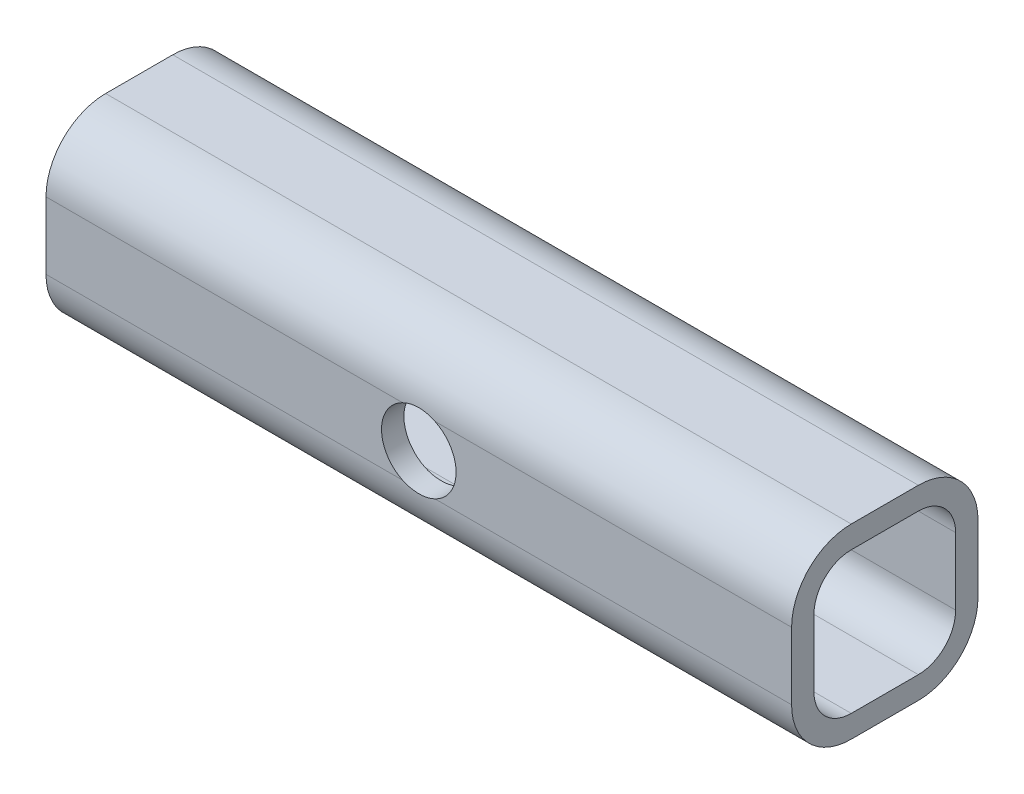
ISO-10303-21;
HEADER;
FILE_DESCRIPTION(('STEP AP214'),'2;1');
FILE_NAME('part.step','',(''),(''),'','','');
FILE_SCHEMA(('AUTOMOTIVE_DESIGN { 1 0 10303 214 1 1 1 1 }'));
ENDSEC;
DATA;
#1=APPLICATION_CONTEXT('core data for automotive mechanical design processes');
#2=APPLICATION_PROTOCOL_DEFINITION('international standard','automotive_design',2000,#1);
#3=PRODUCT_CONTEXT('',#1,'mechanical');
#4=PRODUCT('Part','Part','',(#3));
#5=PRODUCT_RELATED_PRODUCT_CATEGORY('part','',(#4));
#6=PRODUCT_DEFINITION_FORMATION('','',#4);
#7=PRODUCT_DEFINITION_CONTEXT('part definition',#1,'design');
#8=PRODUCT_DEFINITION('design','',#6,#7);
#9=PRODUCT_DEFINITION_SHAPE('','',#8);
#10=(LENGTH_UNIT() NAMED_UNIT(*) SI_UNIT(.MILLI.,.METRE.));
#11=(NAMED_UNIT(*) PLANE_ANGLE_UNIT() SI_UNIT($,.RADIAN.));
#12=(NAMED_UNIT(*) SI_UNIT($,.STERADIAN.) SOLID_ANGLE_UNIT());
#13=UNCERTAINTY_MEASURE_WITH_UNIT(LENGTH_MEASURE(1.E-05),#10,'distance_accuracy_value','');
#14=(GEOMETRIC_REPRESENTATION_CONTEXT(3) GLOBAL_UNCERTAINTY_ASSIGNED_CONTEXT((#13)) GLOBAL_UNIT_ASSIGNED_CONTEXT((#10,
#11,#12)) REPRESENTATION_CONTEXT('',''));
#15=CARTESIAN_POINT('',(0.,0.,0.));
#16=DIRECTION('',(0.,0.,1.));
#17=DIRECTION('',(1.,0.,0.));
#18=AXIS2_PLACEMENT_3D('',#15,#16,#17);
#19=CARTESIAN_POINT('',(0.,-4.5,12.5));
#20=DIRECTION('',(0.,0.,-1.));
#21=DIRECTION('',(-1.,0.,0.));
#22=AXIS2_PLACEMENT_3D('',#19,#20,#21);
#23=PLANE('',#22);
#24=DIRECTION('',(-1.,0.,0.));
#25=VECTOR('',#24,1.);
#26=CARTESIAN_POINT('',(0.,4.5,12.5));
#27=LINE('',#26,#25);
#28=CARTESIAN_POINT('',(0.,4.5,12.5));
#29=VERTEX_POINT('',#28);
#30=CARTESIAN_POINT('',(-47.8205505282297,4.5,12.5));
#31=VERTEX_POINT('',#30);
#32=EDGE_CURVE('E271',#29,#31,#27,.T.);
#33=ORIENTED_EDGE('',*,*,#32,.T.);
#34=CARTESIAN_POINT('',(-50.,0.,12.5));
#35=DIRECTION('',(0.,0.,1.));
#36=DIRECTION('',(1.,0.,0.));
#37=AXIS2_PLACEMENT_3D('',#34,#35,#36);
#38=CIRCLE('',#37,5.);
#39=CARTESIAN_POINT('',(-47.8205505282297,-4.5,12.5));
#40=VERTEX_POINT('',#39);
#41=EDGE_CURVE('E511',#40,#31,#38,.T.);
#42=ORIENTED_EDGE('',*,*,#41,.F.);
#43=DIRECTION('',(-1.,0.,0.));
#44=VECTOR('',#43,1.);
#45=CARTESIAN_POINT('',(0.,-4.5,12.5));
#46=LINE('',#45,#44);
#47=CARTESIAN_POINT('',(0.,-4.5,12.5));
#48=VERTEX_POINT('',#47);
#49=EDGE_CURVE('E267',#48,#40,#46,.T.);
#50=ORIENTED_EDGE('',*,*,#49,.F.);
#51=DIRECTION('',(0.,-1.,0.));
#52=VECTOR('',#51,1.);
#53=CARTESIAN_POINT('',(0.,-4.5,12.5));
#54=LINE('',#53,#52);
#55=EDGE_CURVE('E236',#29,#48,#54,.T.);
#56=ORIENTED_EDGE('',*,*,#55,.F.);
#57=EDGE_LOOP('',(#33,#42,#50,#56));
#58=FACE_BOUND('',#57,.T.);
#59=ADVANCED_FACE('F35',(#58),#23,.F.);
#60=CARTESIAN_POINT('',(0.,-4.5,-12.5));
#61=DIRECTION('',(0.,0.,1.));
#62=DIRECTION('',(1.,0.,0.));
#63=AXIS2_PLACEMENT_3D('',#60,#61,#62);
#64=PLANE('',#63);
#65=DIRECTION('',(-1.,0.,0.));
#66=VECTOR('',#65,1.);
#67=CARTESIAN_POINT('',(0.,4.5,-12.5));
#68=LINE('',#67,#66);
#69=CARTESIAN_POINT('',(-52.1794494717703,4.5,-12.5));
#70=VERTEX_POINT('',#69);
#71=CARTESIAN_POINT('',(-100.,4.5,-12.5));
#72=VERTEX_POINT('',#71);
#73=EDGE_CURVE('E222',#70,#72,#68,.T.);
#74=ORIENTED_EDGE('',*,*,#73,.F.);
#75=CARTESIAN_POINT('',(-50.,0.,-12.5));
#76=DIRECTION('',(0.,0.,1.));
#77=DIRECTION('',(1.,0.,0.));
#78=AXIS2_PLACEMENT_3D('',#75,#76,#77);
#79=CIRCLE('',#78,5.);
#80=CARTESIAN_POINT('',(-52.1794494717703,-4.5,-12.5));
#81=VERTEX_POINT('',#80);
#82=EDGE_CURVE('E65',#70,#81,#79,.T.);
#83=ORIENTED_EDGE('',*,*,#82,.T.);
#84=DIRECTION('',(1.,0.,0.));
#85=VECTOR('',#84,1.);
#86=CARTESIAN_POINT('',(0.,-4.5,-12.5));
#87=LINE('',#86,#85);
#88=CARTESIAN_POINT('',(-100.,-4.5,-12.5));
#89=VERTEX_POINT('',#88);
#90=EDGE_CURVE('E260',#81,#89,#87,.F.);
#91=ORIENTED_EDGE('',*,*,#90,.T.);
#92=DIRECTION('',(0.,1.,0.));
#93=VECTOR('',#92,1.);
#94=CARTESIAN_POINT('',(-100.,-4.5,-12.5));
#95=LINE('',#94,#93);
#96=EDGE_CURVE('E225',#89,#72,#95,.T.);
#97=ORIENTED_EDGE('',*,*,#96,.T.);
#98=EDGE_LOOP('',(#74,#83,#91,#97));
#99=FACE_BOUND('',#98,.T.);
#100=ADVANCED_FACE('F309',(#99),#64,.F.);
#101=CARTESIAN_POINT('',(0.,-4.5,9.5));
#102=DIRECTION('',(0.,0.,-1.));
#103=DIRECTION('',(-1.,0.,0.));
#104=AXIS2_PLACEMENT_3D('',#101,#102,#103);
#105=PLANE('',#104);
#106=CARTESIAN_POINT('',(-50.,0.,9.50000000000001));
#107=DIRECTION('',(0.,0.,-1.));
#108=DIRECTION('',(-1.,0.,0.));
#109=AXIS2_PLACEMENT_3D('',#106,#107,#108);
#110=CIRCLE('',#109,5.);
#111=CARTESIAN_POINT('',(-47.8205505282297,4.5,9.50000000000001));
#112=VERTEX_POINT('',#111);
#113=CARTESIAN_POINT('',(-47.8205505282297,-4.5,9.50000000000001));
#114=VERTEX_POINT('',#113);
#115=EDGE_CURVE('E366',#112,#114,#110,.T.);
#116=ORIENTED_EDGE('',*,*,#115,.F.);
#117=DIRECTION('',(-1.,0.,0.));
#118=VECTOR('',#117,1.);
#119=CARTESIAN_POINT('',(0.,4.5,9.5));
#120=LINE('',#119,#118);
#121=CARTESIAN_POINT('',(0.,4.5,9.5));
#122=VERTEX_POINT('',#121);
#123=EDGE_CURVE('E440',#122,#112,#120,.T.);
#124=ORIENTED_EDGE('',*,*,#123,.F.);
#125=DIRECTION('',(0.,-1.,0.));
#126=VECTOR('',#125,1.);
#127=CARTESIAN_POINT('',(0.,-4.5,9.5));
#128=LINE('',#127,#126);
#129=CARTESIAN_POINT('',(0.,-4.5,9.5));
#130=VERTEX_POINT('',#129);
#131=EDGE_CURVE('E436',#122,#130,#128,.T.);
#132=ORIENTED_EDGE('',*,*,#131,.T.);
#133=DIRECTION('',(-1.,0.,0.));
#134=VECTOR('',#133,1.);
#135=CARTESIAN_POINT('',(0.,-4.5,9.5));
#136=LINE('',#135,#134);
#137=EDGE_CURVE('E449',#130,#114,#136,.T.);
#138=ORIENTED_EDGE('',*,*,#137,.T.);
#139=EDGE_LOOP('',(#116,#124,#132,#138));
#140=FACE_BOUND('',#139,.T.);
#141=ADVANCED_FACE('F377',(#140),#105,.T.);
#142=CARTESIAN_POINT('',(0.,-4.5,-9.5));
#143=DIRECTION('',(0.,0.,1.));
#144=DIRECTION('',(1.,0.,0.));
#145=AXIS2_PLACEMENT_3D('',#142,#143,#144);
#146=PLANE('',#145);
#147=CARTESIAN_POINT('',(-50.,0.,-9.49999999999999));
#148=DIRECTION('',(0.,0.,1.));
#149=DIRECTION('',(1.,0.,0.));
#150=AXIS2_PLACEMENT_3D('',#147,#148,#149);
#151=CIRCLE('',#150,5.);
#152=CARTESIAN_POINT('',(-52.1794494717703,4.5,-9.49999999999999));
#153=VERTEX_POINT('',#152);
#154=CARTESIAN_POINT('',(-52.1794494717703,-4.5,-9.49999999999999));
#155=VERTEX_POINT('',#154);
#156=EDGE_CURVE('E506',#153,#155,#151,.T.);
#157=ORIENTED_EDGE('',*,*,#156,.F.);
#158=DIRECTION('',(-1.,0.,0.));
#159=VECTOR('',#158,1.);
#160=CARTESIAN_POINT('',(0.,4.5,-9.5));
#161=LINE('',#160,#159);
#162=CARTESIAN_POINT('',(-100.,4.5,-9.49999999999999));
#163=VERTEX_POINT('',#162);
#164=EDGE_CURVE('E481',#153,#163,#161,.T.);
#165=ORIENTED_EDGE('',*,*,#164,.T.);
#166=DIRECTION('',(0.,1.,0.));
#167=VECTOR('',#166,1.);
#168=CARTESIAN_POINT('',(-100.,-4.5,-9.49999999999999));
#169=LINE('',#168,#167);
#170=CARTESIAN_POINT('',(-100.,-4.5,-9.49999999999999));
#171=VERTEX_POINT('',#170);
#172=EDGE_CURVE('E477',#171,#163,#169,.T.);
#173=ORIENTED_EDGE('',*,*,#172,.F.);
#174=DIRECTION('',(-1.,0.,0.));
#175=VECTOR('',#174,1.);
#176=CARTESIAN_POINT('',(0.,-4.5,-9.5));
#177=LINE('',#176,#175);
#178=EDGE_CURVE('E473',#155,#171,#177,.T.);
#179=ORIENTED_EDGE('',*,*,#178,.F.);
#180=EDGE_LOOP('',(#157,#165,#173,#179));
#181=FACE_BOUND('',#180,.T.);
#182=ADVANCED_FACE('F394',(#181),#146,.T.);
#183=CARTESIAN_POINT('',(0.,4.5,4.5));
#184=DIRECTION('',(1.,0.,0.));
#185=DIRECTION('',(0.,0.,-1.));
#186=AXIS2_PLACEMENT_3D('',#183,#184,#185);
#187=PLANE('',#186);
#188=CARTESIAN_POINT('',(0.,4.5,4.5));
#189=DIRECTION('',(1.,0.,0.));
#190=DIRECTION('',(0.,0.,-1.));
#191=AXIS2_PLACEMENT_3D('',#188,#189,#190);
#192=CIRCLE('',#191,5.);
#193=CARTESIAN_POINT('',(0.,9.5,4.5));
#194=VERTEX_POINT('',#193);
#195=EDGE_CURVE('E423',#194,#122,#192,.T.);
#196=ORIENTED_EDGE('',*,*,#195,.F.);
#197=DIRECTION('',(0.,0.,1.));
#198=VECTOR('',#197,1.);
#199=CARTESIAN_POINT('',(0.,9.5,4.5));
#200=LINE('',#199,#198);
#201=CARTESIAN_POINT('',(0.,9.5,-4.5));
#202=VERTEX_POINT('',#201);
#203=EDGE_CURVE('E421',#202,#194,#200,.T.);
#204=ORIENTED_EDGE('',*,*,#203,.F.);
#205=CARTESIAN_POINT('',(0.,4.5,-4.5));
#206=DIRECTION('',(1.,0.,0.));
#207=DIRECTION('',(0.,0.,-1.));
#208=AXIS2_PLACEMENT_3D('',#205,#206,#207);
#209=CIRCLE('',#208,5.);
#210=CARTESIAN_POINT('',(0.,4.5,-9.5));
#211=VERTEX_POINT('',#210);
#212=EDGE_CURVE('E434',#211,#202,#209,.T.);
#213=ORIENTED_EDGE('',*,*,#212,.F.);
#214=DIRECTION('',(0.,1.,0.));
#215=VECTOR('',#214,1.);
#216=CARTESIAN_POINT('',(0.,-4.5,-9.5));
#217=LINE('',#216,#215);
#218=CARTESIAN_POINT('',(0.,-4.5,-9.5));
#219=VERTEX_POINT('',#218);
#220=EDGE_CURVE('E470',#219,#211,#217,.T.);
#221=ORIENTED_EDGE('',*,*,#220,.F.);
#222=CARTESIAN_POINT('',(0.,-4.5,-4.5));
#223=DIRECTION('',(1.,0.,0.));
#224=DIRECTION('',(0.,0.,-1.));
#225=AXIS2_PLACEMENT_3D('',#222,#223,#224);
#226=CIRCLE('',#225,5.);
#227=CARTESIAN_POINT('',(0.,-9.5,-4.5));
#228=VERTEX_POINT('',#227);
#229=EDGE_CURVE('E462',#228,#219,#226,.T.);
#230=ORIENTED_EDGE('',*,*,#229,.F.);
#231=DIRECTION('',(0.,0.,-1.));
#232=VECTOR('',#231,1.);
#233=CARTESIAN_POINT('',(0.,-9.5,4.5));
#234=LINE('',#233,#232);
#235=CARTESIAN_POINT('',(0.,-9.5,4.5));
#236=VERTEX_POINT('',#235);
#237=EDGE_CURVE('E454',#236,#228,#234,.T.);
#238=ORIENTED_EDGE('',*,*,#237,.F.);
#239=CARTESIAN_POINT('',(0.,-4.5,4.5));
#240=DIRECTION('',(1.,0.,0.));
#241=DIRECTION('',(0.,0.,-1.));
#242=AXIS2_PLACEMENT_3D('',#239,#240,#241);
#243=CIRCLE('',#242,5.);
#244=EDGE_CURVE('E445',#130,#236,#243,.T.);
#245=ORIENTED_EDGE('',*,*,#244,.F.);
#246=ORIENTED_EDGE('',*,*,#131,.F.);
#247=EDGE_LOOP('',(#196,#204,#213,#221,#230,#238,#245,#246));
#248=FACE_BOUND('',#247,.T.);
#249=CARTESIAN_POINT('',(0.,4.5,4.5));
#250=DIRECTION('',(1.,0.,0.));
#251=DIRECTION('',(0.,0.,-1.));
#252=AXIS2_PLACEMENT_3D('',#249,#250,#251);
#253=CIRCLE('',#252,8.);
#254=CARTESIAN_POINT('',(0.,12.5,4.5));
#255=VERTEX_POINT('',#254);
#256=EDGE_CURVE('E232',#255,#29,#253,.T.);
#257=ORIENTED_EDGE('',*,*,#256,.T.);
#258=ORIENTED_EDGE('',*,*,#55,.T.);
#259=CARTESIAN_POINT('',(0.,-4.5,4.5));
#260=DIRECTION('',(1.,0.,0.));
#261=DIRECTION('',(0.,0.,-1.));
#262=AXIS2_PLACEMENT_3D('',#259,#260,#261);
#263=CIRCLE('',#262,8.);
#264=CARTESIAN_POINT('',(0.,-12.5,4.5));
#265=VERTEX_POINT('',#264);
#266=EDGE_CURVE('E239',#48,#265,#263,.T.);
#267=ORIENTED_EDGE('',*,*,#266,.T.);
#268=DIRECTION('',(0.,0.,-1.));
#269=VECTOR('',#268,1.);
#270=CARTESIAN_POINT('',(0.,-12.5,4.5));
#271=LINE('',#270,#269);
#272=CARTESIAN_POINT('',(0.,-12.5,-4.5));
#273=VERTEX_POINT('',#272);
#274=EDGE_CURVE('E242',#265,#273,#271,.T.);
#275=ORIENTED_EDGE('',*,*,#274,.T.);
#276=CARTESIAN_POINT('',(0.,-4.5,-4.5));
#277=DIRECTION('',(1.,0.,0.));
#278=DIRECTION('',(0.,0.,-1.));
#279=AXIS2_PLACEMENT_3D('',#276,#277,#278);
#280=CIRCLE('',#279,8.);
#281=CARTESIAN_POINT('',(0.,-4.5,-12.5));
#282=VERTEX_POINT('',#281);
#283=EDGE_CURVE('E245',#273,#282,#280,.T.);
#284=ORIENTED_EDGE('',*,*,#283,.T.);
#285=DIRECTION('',(0.,1.,0.));
#286=VECTOR('',#285,1.);
#287=CARTESIAN_POINT('',(0.,-4.5,-12.5));
#288=LINE('',#287,#286);
#289=CARTESIAN_POINT('',(0.,4.5,-12.5));
#290=VERTEX_POINT('',#289);
#291=EDGE_CURVE('E248',#282,#290,#288,.T.);
#292=ORIENTED_EDGE('',*,*,#291,.T.);
#293=CARTESIAN_POINT('',(0.,4.5,-4.5));
#294=DIRECTION('',(1.,0.,0.));
#295=DIRECTION('',(0.,0.,-1.));
#296=AXIS2_PLACEMENT_3D('',#293,#294,#295);
#297=CIRCLE('',#296,8.);
#298=CARTESIAN_POINT('',(0.,12.5,-4.5));
#299=VERTEX_POINT('',#298);
#300=EDGE_CURVE('E220',#290,#299,#297,.T.);
#301=ORIENTED_EDGE('',*,*,#300,.T.);
#302=DIRECTION('',(0.,0.,1.));
#303=VECTOR('',#302,1.);
#304=CARTESIAN_POINT('',(0.,12.5,4.5));
#305=LINE('',#304,#303);
#306=EDGE_CURVE('E229',#299,#255,#305,.T.);
#307=ORIENTED_EDGE('',*,*,#306,.T.);
#308=EDGE_LOOP('',(#257,#258,#267,#275,#284,#292,#301,#307));
#309=FACE_BOUND('',#308,.T.);
#310=ADVANCED_FACE('F399',(#248,#309),#187,.T.);
#311=CARTESIAN_POINT('',(-100.,4.5,4.50000000000001));
#312=DIRECTION('',(1.,0.,0.));
#313=DIRECTION('',(0.,0.,-1.));
#314=AXIS2_PLACEMENT_3D('',#311,#312,#313);
#315=PLANE('',#314);
#316=DIRECTION('',(0.,0.,1.));
#317=VECTOR('',#316,1.);
#318=CARTESIAN_POINT('',(-100.,9.5,4.50000000000001));
#319=LINE('',#318,#317);
#320=CARTESIAN_POINT('',(-100.,9.5,-4.49999999999999));
#321=VERTEX_POINT('',#320);
#322=CARTESIAN_POINT('',(-100.,9.5,4.50000000000001));
#323=VERTEX_POINT('',#322);
#324=EDGE_CURVE('E424',#321,#323,#319,.T.);
#325=ORIENTED_EDGE('',*,*,#324,.T.);
#326=CARTESIAN_POINT('',(-100.,4.5,4.50000000000001));
#327=DIRECTION('',(1.,0.,0.));
#328=DIRECTION('',(0.,0.,-1.));
#329=AXIS2_PLACEMENT_3D('',#326,#327,#328);
#330=CIRCLE('',#329,5.);
#331=CARTESIAN_POINT('',(-100.,4.5,9.50000000000001));
#332=VERTEX_POINT('',#331);
#333=EDGE_CURVE('E431',#323,#332,#330,.T.);
#334=ORIENTED_EDGE('',*,*,#333,.T.);
#335=DIRECTION('',(0.,-1.,0.));
#336=VECTOR('',#335,1.);
#337=CARTESIAN_POINT('',(-100.,-4.5,9.50000000000001));
#338=LINE('',#337,#336);
#339=CARTESIAN_POINT('',(-100.,-4.5,9.50000000000001));
#340=VERTEX_POINT('',#339);
#341=EDGE_CURVE('E443',#332,#340,#338,.T.);
#342=ORIENTED_EDGE('',*,*,#341,.T.);
#343=CARTESIAN_POINT('',(-100.,-4.5,4.50000000000001));
#344=DIRECTION('',(1.,0.,0.));
#345=DIRECTION('',(0.,0.,-1.));
#346=AXIS2_PLACEMENT_3D('',#343,#344,#345);
#347=CIRCLE('',#346,5.);
#348=CARTESIAN_POINT('',(-100.,-9.5,4.50000000000001));
#349=VERTEX_POINT('',#348);
#350=EDGE_CURVE('E452',#340,#349,#347,.T.);
#351=ORIENTED_EDGE('',*,*,#350,.T.);
#352=DIRECTION('',(0.,0.,-1.));
#353=VECTOR('',#352,1.);
#354=CARTESIAN_POINT('',(-100.,-9.5,4.50000000000001));
#355=LINE('',#354,#353);
#356=CARTESIAN_POINT('',(-100.,-9.5,-4.49999999999999));
#357=VERTEX_POINT('',#356);
#358=EDGE_CURVE('E460',#349,#357,#355,.T.);
#359=ORIENTED_EDGE('',*,*,#358,.T.);
#360=CARTESIAN_POINT('',(-100.,-4.5,-4.49999999999999));
#361=DIRECTION('',(1.,0.,0.));
#362=DIRECTION('',(0.,0.,-1.));
#363=AXIS2_PLACEMENT_3D('',#360,#361,#362);
#364=CIRCLE('',#363,5.);
#365=EDGE_CURVE('E468',#357,#171,#364,.T.);
#366=ORIENTED_EDGE('',*,*,#365,.T.);
#367=ORIENTED_EDGE('',*,*,#172,.T.);
#368=CARTESIAN_POINT('',(-100.,4.5,-4.49999999999999));
#369=DIRECTION('',(1.,0.,0.));
#370=DIRECTION('',(0.,0.,-1.));
#371=AXIS2_PLACEMENT_3D('',#368,#369,#370);
#372=CIRCLE('',#371,5.);
#373=EDGE_CURVE('E233',#163,#321,#372,.T.);
#374=ORIENTED_EDGE('',*,*,#373,.T.);
#375=EDGE_LOOP('',(#325,#334,#342,#351,#359,#366,#367,#374));
#376=FACE_BOUND('',#375,.T.);
#377=CARTESIAN_POINT('',(-100.,4.5,4.50000000000001));
#378=DIRECTION('',(1.,0.,0.));
#379=DIRECTION('',(0.,0.,-1.));
#380=AXIS2_PLACEMENT_3D('',#377,#378,#379);
#381=CIRCLE('',#380,8.);
#382=CARTESIAN_POINT('',(-100.,12.5,4.50000000000001));
#383=VERTEX_POINT('',#382);
#384=CARTESIAN_POINT('',(-100.,4.5,12.5));
#385=VERTEX_POINT('',#384);
#386=EDGE_CURVE('E272',#383,#385,#381,.T.);
#387=ORIENTED_EDGE('',*,*,#386,.F.);
#388=DIRECTION('',(0.,0.,1.));
#389=VECTOR('',#388,1.);
#390=CARTESIAN_POINT('',(-100.,12.5,4.5));
#391=LINE('',#390,#389);
#392=CARTESIAN_POINT('',(-100.,12.5,-4.49999999999999));
#393=VERTEX_POINT('',#392);
#394=EDGE_CURVE('E252',#393,#383,#391,.T.);
#395=ORIENTED_EDGE('',*,*,#394,.F.);
#396=CARTESIAN_POINT('',(-100.,4.5,-4.49999999999999));
#397=DIRECTION('',(1.,0.,0.));
#398=DIRECTION('',(0.,0.,-1.));
#399=AXIS2_PLACEMENT_3D('',#396,#397,#398);
#400=CIRCLE('',#399,8.);
#401=EDGE_CURVE('E50',#72,#393,#400,.T.);
#402=ORIENTED_EDGE('',*,*,#401,.F.);
#403=ORIENTED_EDGE('',*,*,#96,.F.);
#404=CARTESIAN_POINT('',(-100.,-4.5,-4.49999999999999));
#405=DIRECTION('',(1.,0.,0.));
#406=DIRECTION('',(0.,0.,-1.));
#407=AXIS2_PLACEMENT_3D('',#404,#405,#406);
#408=CIRCLE('',#407,8.);
#409=CARTESIAN_POINT('',(-100.,-12.5,-4.49999999999999));
#410=VERTEX_POINT('',#409);
#411=EDGE_CURVE('E257',#410,#89,#408,.T.);
#412=ORIENTED_EDGE('',*,*,#411,.F.);
#413=DIRECTION('',(0.,0.,-1.));
#414=VECTOR('',#413,1.);
#415=CARTESIAN_POINT('',(-100.,-12.5,4.5));
#416=LINE('',#415,#414);
#417=CARTESIAN_POINT('',(-100.,-12.5,4.50000000000001));
#418=VERTEX_POINT('',#417);
#419=EDGE_CURVE('E262',#418,#410,#416,.T.);
#420=ORIENTED_EDGE('',*,*,#419,.F.);
#421=CARTESIAN_POINT('',(-100.,-4.5,4.50000000000001));
#422=DIRECTION('',(1.,0.,0.));
#423=DIRECTION('',(0.,0.,-1.));
#424=AXIS2_PLACEMENT_3D('',#421,#422,#423);
#425=CIRCLE('',#424,8.);
#426=CARTESIAN_POINT('',(-100.,-4.5,12.5));
#427=VERTEX_POINT('',#426);
#428=EDGE_CURVE('E265',#427,#418,#425,.T.);
#429=ORIENTED_EDGE('',*,*,#428,.F.);
#430=DIRECTION('',(0.,-1.,0.));
#431=VECTOR('',#430,1.);
#432=CARTESIAN_POINT('',(-100.,-4.5,12.5));
#433=LINE('',#432,#431);
#434=EDGE_CURVE('E268',#385,#427,#433,.T.);
#435=ORIENTED_EDGE('',*,*,#434,.F.);
#436=EDGE_LOOP('',(#387,#395,#402,#403,#412,#420,#429,#435));
#437=FACE_BOUND('',#436,.T.);
#438=ADVANCED_FACE('F305',(#376,#437),#315,.F.);
#439=CARTESIAN_POINT('',(0.,12.5,4.5));
#440=DIRECTION('',(0.,-1.,0.));
#441=DIRECTION('',(0.,0.,-1.));
#442=AXIS2_PLACEMENT_3D('',#439,#440,#441);
#443=PLANE('',#442);
#444=DIRECTION('',(-1.,0.,0.));
#445=VECTOR('',#444,1.);
#446=CARTESIAN_POINT('',(0.,12.5,4.5));
#447=LINE('',#446,#445);
#448=EDGE_CURVE('E253',#255,#383,#447,.T.);
#449=ORIENTED_EDGE('',*,*,#448,.F.);
#450=ORIENTED_EDGE('',*,*,#306,.F.);
#451=DIRECTION('',(1.,0.,0.));
#452=VECTOR('',#451,1.);
#453=CARTESIAN_POINT('',(0.,12.5,-4.5));
#454=LINE('',#453,#452);
#455=EDGE_CURVE('E251',#299,#393,#454,.F.);
#456=ORIENTED_EDGE('',*,*,#455,.T.);
#457=ORIENTED_EDGE('',*,*,#394,.T.);
#458=EDGE_LOOP('',(#449,#450,#456,#457));
#459=FACE_BOUND('',#458,.T.);
#460=ADVANCED_FACE('F402',(#459),#443,.F.);
#461=CARTESIAN_POINT('',(0.,4.5,4.5));
#462=DIRECTION('',(-1.,0.,0.));
#463=DIRECTION('',(0.,0.,1.));
#464=AXIS2_PLACEMENT_3D('',#461,#462,#463);
#465=CYLINDRICAL_SURFACE('',#464,8.);
#466=CARTESIAN_POINT('',(-52.1794494717703,4.5,12.5));
#467=VERTEX_POINT('',#466);
#468=EDGE_CURVE('E274',#467,#385,#27,.T.);
#469=ORIENTED_EDGE('',*,*,#468,.F.);
#470=CARTESIAN_POINT('',(-52.1794494717703,4.5,12.5));
#471=CARTESIAN_POINT('',(-52.0529478300876,4.56128411344572,12.4999799935828));
#472=CARTESIAN_POINT('',(-51.9238552954115,4.61720447636696,12.4992947493227));
#473=CARTESIAN_POINT('',(-51.6614325138707,4.71798225597904,12.4971939243943));
#474=CARTESIAN_POINT('',(-51.528102431954,4.76284010268792,12.4957783721208));
#475=CARTESIAN_POINT('',(-51.2582258291224,4.84113692851113,12.4928179319154));
#476=CARTESIAN_POINT('',(-51.121681441249,4.87458326408955,12.4912731281088));
#477=CARTESIAN_POINT('',(-50.8462631530061,4.92986440388934,12.4884910740641));
#478=CARTESIAN_POINT('',(-50.7073893243357,4.95169956482375,12.4872538143783));
#479=CARTESIAN_POINT('',(-50.4281796716826,4.9836153807697,12.4853848515291));
#480=CARTESIAN_POINT('',(-50.287842763891,4.99368658879147,12.4847536351183));
#481=CARTESIAN_POINT('',(-50.0068182701999,5.00197121222457,12.484237114119));
#482=CARTESIAN_POINT('',(-49.8661306815874,5.00018453561296,12.4843518153192));
#483=CARTESIAN_POINT('',(-49.5855074311757,4.98476910768734,12.485302730688));
#484=CARTESIAN_POINT('',(-49.4455712897506,4.97114912572595,12.4861384105549));
#485=CARTESIAN_POINT('',(-49.167398427904,4.93219106788719,12.4883405011323));
#486=CARTESIAN_POINT('',(-49.0291613272427,4.90685566477489,12.4897067907777));
#487=CARTESIAN_POINT('',(-48.7071847764906,4.8336923746321,12.4931504428644));
#488=CARTESIAN_POINT('',(-48.5244969392501,4.78109170533736,12.4953091021491));
#489=CARTESIAN_POINT('',(-48.2560096056946,4.68695066847428,12.4978757015643));
#490=CARTESIAN_POINT('',(-48.1674581201682,4.65304010595754,12.4986192402323));
#491=CARTESIAN_POINT('',(-47.9924035828216,4.58023330366594,12.4996801542111));
#492=CARTESIAN_POINT('',(-47.9059009880893,4.54133596357172,12.4999974352914));
#493=CARTESIAN_POINT('',(-47.8205505282297,4.50000000000001,12.5));
#494=B_SPLINE_CURVE_WITH_KNOTS('',3,(#470,#471,#472,#473,#474,#475,#476,#477,#478,#479,#480,
#481,#482,#483,#484,#485,#486,#487,#488,#489,#490,#491,#492,#493),.UNSPECIFIED.,.F.,.F.,(4,2,2,
2,2,2,2,2,2,2,2,4),(0.,0.421558379249341,0.843100369253753,1.26437009524485,1.68562687843795,
2.10722171794139,2.52881982922919,2.95010577144031,3.37129564853964,3.94025767423398,
4.22460465659069,4.50901448769115),.UNSPECIFIED.);
#495=EDGE_CURVE('E312',#467,#31,#494,.T.);
#496=ORIENTED_EDGE('',*,*,#495,.T.);
#497=ORIENTED_EDGE('',*,*,#32,.F.);
#498=ORIENTED_EDGE('',*,*,#256,.F.);
#499=ORIENTED_EDGE('',*,*,#448,.T.);
#500=ORIENTED_EDGE('',*,*,#386,.T.);
#501=EDGE_LOOP('',(#469,#496,#497,#498,#499,#500));
#502=FACE_BOUND('',#501,.T.);
#503=ADVANCED_FACE('F409',(#502),#465,.T.);
#504=CARTESIAN_POINT('',(-52.1794494717703,-4.5,12.5));
#505=VERTEX_POINT('',#504);
#506=EDGE_CURVE('E270',#505,#427,#46,.T.);
#507=ORIENTED_EDGE('',*,*,#506,.F.);
#508=EDGE_CURVE('E57',#467,#505,#38,.T.);
#509=ORIENTED_EDGE('',*,*,#508,.F.);
#510=ORIENTED_EDGE('',*,*,#468,.T.);
#511=ORIENTED_EDGE('',*,*,#434,.T.);
#512=EDGE_LOOP('',(#507,#509,#510,#511));
#513=FACE_BOUND('',#512,.T.);
#514=ADVANCED_FACE('F414',(#513),#23,.F.);
#515=CARTESIAN_POINT('',(0.,-4.5,4.5));
#516=DIRECTION('',(-1.,0.,0.));
#517=DIRECTION('',(0.,0.,1.));
#518=AXIS2_PLACEMENT_3D('',#515,#516,#517);
#519=CYLINDRICAL_SURFACE('',#518,8.);
#520=ORIENTED_EDGE('',*,*,#49,.T.);
#521=CARTESIAN_POINT('',(-47.8205505282297,-4.5,12.5));
#522=CARTESIAN_POINT('',(-47.9470521699124,-4.56128411344573,12.4999799935828));
#523=CARTESIAN_POINT('',(-48.0761447045885,-4.61720447636697,12.4992947493227));
#524=CARTESIAN_POINT('',(-48.3385674861293,-4.71798225597905,12.4971939243943));
#525=CARTESIAN_POINT('',(-48.471897568046,-4.76284010268793,12.4957783721208));
#526=CARTESIAN_POINT('',(-48.7417741708776,-4.84113692851113,12.4928179319154));
#527=CARTESIAN_POINT('',(-48.878318558751,-4.87458326408956,12.4912731281088));
#528=CARTESIAN_POINT('',(-49.153736846994,-4.92986440388935,12.4884910740641));
#529=CARTESIAN_POINT('',(-49.2926106756643,-4.95169956482375,12.4872538143783));
#530=CARTESIAN_POINT('',(-49.5718203283174,-4.98361538076971,12.4853848515291));
#531=CARTESIAN_POINT('',(-49.712157236109,-4.99368658879147,12.4847536351183));
#532=CARTESIAN_POINT('',(-49.9931817298001,-5.00197121222457,12.484237114119));
#533=CARTESIAN_POINT('',(-50.1338693184126,-5.00018453561296,12.4843518153192));
#534=CARTESIAN_POINT('',(-50.4144925688243,-4.98476910768734,12.485302730688));
#535=CARTESIAN_POINT('',(-50.5544287102494,-4.97114912572595,12.4861384105549));
#536=CARTESIAN_POINT('',(-50.832601572096,-4.93219106788718,12.4883405011323));
#537=CARTESIAN_POINT('',(-50.9708386727573,-4.90685566477489,12.4897067907777));
#538=CARTESIAN_POINT('',(-51.2928152235094,-4.8336923746321,12.4931504428644));
#539=CARTESIAN_POINT('',(-51.4755030607499,-4.78109170533736,12.4953091021491));
#540=CARTESIAN_POINT('',(-51.7439903943055,-4.68695066847427,12.4978757015643));
#541=CARTESIAN_POINT('',(-51.8325418798318,-4.65304010595753,12.4986192402323));
#542=CARTESIAN_POINT('',(-52.0075964171784,-4.58023330366593,12.4996801542111));
#543=CARTESIAN_POINT('',(-52.0940990119107,-4.54133596357171,12.4999974352914));
#544=CARTESIAN_POINT('',(-52.1794494717703,-4.5,12.5));
#545=B_SPLINE_CURVE_WITH_KNOTS('',3,(#521,#522,#523,#524,#525,#526,#527,#528,#529,#530,#531,
#532,#533,#534,#535,#536,#537,#538,#539,#540,#541,#542,#543,#544),.UNSPECIFIED.,.F.,.F.,(4,2,2,
2,2,2,2,2,2,2,2,4),(0.,0.421558379249339,0.84310036925375,1.26437009524483,1.68562687843794,
2.10722171794138,2.52881982922918,2.95010577144029,3.37129564853964,3.94025767423398,
4.22460465659069,4.50901448769114),.UNSPECIFIED.);
#546=EDGE_CURVE('E310',#40,#505,#545,.T.);
#547=ORIENTED_EDGE('',*,*,#546,.T.);
#548=ORIENTED_EDGE('',*,*,#506,.T.);
#549=ORIENTED_EDGE('',*,*,#428,.T.);
#550=DIRECTION('',(1.,0.,0.));
#551=VECTOR('',#550,1.);
#552=CARTESIAN_POINT('',(0.,-12.5,4.5));
#553=LINE('',#552,#551);
#554=EDGE_CURVE('E264',#265,#418,#553,.F.);
#555=ORIENTED_EDGE('',*,*,#554,.F.);
#556=ORIENTED_EDGE('',*,*,#266,.F.);
#557=EDGE_LOOP('',(#520,#547,#548,#549,#555,#556));
#558=FACE_BOUND('',#557,.T.);
#559=ADVANCED_FACE('F519',(#558),#519,.T.);
#560=CARTESIAN_POINT('',(0.,-12.5,4.5));
#561=DIRECTION('',(0.,1.,0.));
#562=DIRECTION('',(0.,0.,1.));
#563=AXIS2_PLACEMENT_3D('',#560,#561,#562);
#564=PLANE('',#563);
#565=DIRECTION('',(-1.,0.,0.));
#566=VECTOR('',#565,1.);
#567=CARTESIAN_POINT('',(0.,-12.5,-4.5));
#568=LINE('',#567,#566);
#569=EDGE_CURVE('E261',#273,#410,#568,.T.);
#570=ORIENTED_EDGE('',*,*,#569,.F.);
#571=ORIENTED_EDGE('',*,*,#274,.F.);
#572=ORIENTED_EDGE('',*,*,#554,.T.);
#573=ORIENTED_EDGE('',*,*,#419,.T.);
#574=EDGE_LOOP('',(#570,#571,#572,#573));
#575=FACE_BOUND('',#574,.T.);
#576=ADVANCED_FACE('F300',(#575),#564,.F.);
#577=CARTESIAN_POINT('',(0.,-4.5,-4.5));
#578=DIRECTION('',(-1.,0.,0.));
#579=DIRECTION('',(0.,0.,1.));
#580=AXIS2_PLACEMENT_3D('',#577,#578,#579);
#581=CYLINDRICAL_SURFACE('',#580,8.);
#582=ORIENTED_EDGE('',*,*,#90,.F.);
#583=CARTESIAN_POINT('',(-52.1794494717703,-4.5,-12.5));
#584=CARTESIAN_POINT('',(-52.0529478300876,-4.56128411344572,-12.4999799935828));
#585=CARTESIAN_POINT('',(-51.9238552954115,-4.61720447636696,-12.4992947493227));
#586=CARTESIAN_POINT('',(-51.6614325138707,-4.71798225597904,-12.4971939243943));
#587=CARTESIAN_POINT('',(-51.528102431954,-4.76284010268792,-12.4957783721208));
#588=CARTESIAN_POINT('',(-51.2582258291224,-4.84113692851113,-12.4928179319154));
#589=CARTESIAN_POINT('',(-51.121681441249,-4.87458326408955,-12.4912731281088));
#590=CARTESIAN_POINT('',(-50.8462631530061,-4.92986440388934,-12.4884910740641));
#591=CARTESIAN_POINT('',(-50.7073893243357,-4.95169956482375,-12.4872538143783));
#592=CARTESIAN_POINT('',(-50.4281796716826,-4.9836153807697,-12.4853848515291));
#593=CARTESIAN_POINT('',(-50.287842763891,-4.99368658879147,-12.4847536351183));
#594=CARTESIAN_POINT('',(-50.0068182701999,-5.00197121222457,-12.484237114119));
#595=CARTESIAN_POINT('',(-49.8661306815874,-5.00018453561296,-12.4843518153192));
#596=CARTESIAN_POINT('',(-49.5855074311757,-4.98476910768734,-12.4853027306879));
#597=CARTESIAN_POINT('',(-49.4455712897506,-4.97114912572595,-12.4861384105549));
#598=CARTESIAN_POINT('',(-49.167398427904,-4.93219106788719,-12.4883405011323));
#599=CARTESIAN_POINT('',(-49.0291613272427,-4.90685566477489,-12.4897067907777));
#600=CARTESIAN_POINT('',(-48.7071847764906,-4.8336923746321,-12.4931504428644));
#601=CARTESIAN_POINT('',(-48.5244969392501,-4.78109170533736,-12.4953091021491));
#602=CARTESIAN_POINT('',(-48.2560096056946,-4.68695066847428,-12.4978757015642));
#603=CARTESIAN_POINT('',(-48.1674581201682,-4.65304010595754,-12.4986192402323));
#604=CARTESIAN_POINT('',(-47.9924035828216,-4.58023330366594,-12.4996801542111));
#605=CARTESIAN_POINT('',(-47.9059009880893,-4.54133596357172,-12.4999974352913));
#606=CARTESIAN_POINT('',(-47.8205505282297,-4.50000000000001,-12.5));
#607=B_SPLINE_CURVE_WITH_KNOTS('',3,(#583,#584,#585,#586,#587,#588,#589,#590,#591,#592,#593,
#594,#595,#596,#597,#598,#599,#600,#601,#602,#603,#604,#605,#606),.UNSPECIFIED.,.F.,.F.,(4,2,2,
2,2,2,2,2,2,2,2,4),(0.,0.421558379249342,0.843100369253747,1.26437009524483,1.68562687843794,
2.1072217179414,2.52881982922919,2.95010577144031,3.37129564853963,3.94025767423397,
4.22460465659068,4.50901448769115),.UNSPECIFIED.);
#608=CARTESIAN_POINT('',(-47.8205505282297,-4.5,-12.5));
#609=VERTEX_POINT('',#608);
#610=EDGE_CURVE('E207',#81,#609,#607,.T.);
#611=ORIENTED_EDGE('',*,*,#610,.T.);
#612=EDGE_CURVE('E216',#282,#609,#87,.F.);
#613=ORIENTED_EDGE('',*,*,#612,.F.);
#614=ORIENTED_EDGE('',*,*,#283,.F.);
#615=ORIENTED_EDGE('',*,*,#569,.T.);
#616=ORIENTED_EDGE('',*,*,#411,.T.);
#617=EDGE_LOOP('',(#582,#611,#613,#614,#615,#616));
#618=FACE_BOUND('',#617,.T.);
#619=ADVANCED_FACE('F296',(#618),#581,.T.);
#620=ORIENTED_EDGE('',*,*,#612,.T.);
#621=CARTESIAN_POINT('',(-47.8205505282297,4.5,-12.5));
#622=VERTEX_POINT('',#621);
#623=EDGE_CURVE('E202',#609,#622,#79,.T.);
#624=ORIENTED_EDGE('',*,*,#623,.T.);
#625=EDGE_CURVE('E214',#290,#622,#68,.T.);
#626=ORIENTED_EDGE('',*,*,#625,.F.);
#627=ORIENTED_EDGE('',*,*,#291,.F.);
#628=EDGE_LOOP('',(#620,#624,#626,#627));
#629=FACE_BOUND('',#628,.T.);
#630=ADVANCED_FACE('F213',(#629),#64,.F.);
#631=CARTESIAN_POINT('',(0.,4.5,-4.5));
#632=DIRECTION('',(-1.,0.,0.));
#633=DIRECTION('',(0.,0.,1.));
#634=AXIS2_PLACEMENT_3D('',#631,#632,#633);
#635=CYLINDRICAL_SURFACE('',#634,8.);
#636=ORIENTED_EDGE('',*,*,#625,.T.);
#637=CARTESIAN_POINT('',(-47.8205505282297,4.5,-12.5));
#638=CARTESIAN_POINT('',(-47.9470521699124,4.56128411344573,-12.4999799935828));
#639=CARTESIAN_POINT('',(-48.0761447045885,4.61720447636697,-12.4992947493227));
#640=CARTESIAN_POINT('',(-48.3385674861293,4.71798225597905,-12.4971939243943));
#641=CARTESIAN_POINT('',(-48.471897568046,4.76284010268793,-12.4957783721208));
#642=CARTESIAN_POINT('',(-48.7417741708776,4.84113692851113,-12.4928179319154));
#643=CARTESIAN_POINT('',(-48.878318558751,4.87458326408956,-12.4912731281088));
#644=CARTESIAN_POINT('',(-49.153736846994,4.92986440388935,-12.4884910740641));
#645=CARTESIAN_POINT('',(-49.2926106756643,4.95169956482375,-12.4872538143783));
#646=CARTESIAN_POINT('',(-49.5718203283174,4.98361538076971,-12.4853848515291));
#647=CARTESIAN_POINT('',(-49.712157236109,4.99368658879147,-12.4847536351183));
#648=CARTESIAN_POINT('',(-49.9931817298001,5.00197121222457,-12.484237114119));
#649=CARTESIAN_POINT('',(-50.1338693184126,5.00018453561296,-12.4843518153192));
#650=CARTESIAN_POINT('',(-50.4144925688243,4.98476910768734,-12.4853027306879));
#651=CARTESIAN_POINT('',(-50.5544287102494,4.97114912572595,-12.4861384105549));
#652=CARTESIAN_POINT('',(-50.832601572096,4.93219106788718,-12.4883405011323));
#653=CARTESIAN_POINT('',(-50.9708386727573,4.90685566477489,-12.4897067907777));
#654=CARTESIAN_POINT('',(-51.2928152235094,4.8336923746321,-12.4931504428644));
#655=CARTESIAN_POINT('',(-51.4755030607499,4.78109170533736,-12.4953091021491));
#656=CARTESIAN_POINT('',(-51.7439903943055,4.68695066847427,-12.4978757015642));
#657=CARTESIAN_POINT('',(-51.8325418798318,4.65304010595753,-12.4986192402323));
#658=CARTESIAN_POINT('',(-52.0075964171784,4.58023330366593,-12.4996801542111));
#659=CARTESIAN_POINT('',(-52.0940990119107,4.54133596357171,-12.4999974352913));
#660=CARTESIAN_POINT('',(-52.1794494717703,4.5,-12.5));
#661=B_SPLINE_CURVE_WITH_KNOTS('',3,(#637,#638,#639,#640,#641,#642,#643,#644,#645,#646,#647,
#648,#649,#650,#651,#652,#653,#654,#655,#656,#657,#658,#659,#660),.UNSPECIFIED.,.F.,.F.,(4,2,2,
2,2,2,2,2,2,2,2,4),(0.,0.421558379249339,0.843100369253749,1.26437009524483,1.68562687843794,
2.10722171794138,2.52881982922918,2.95010577144029,3.37129564853964,3.94025767423398,
4.22460465659069,4.50901448769114),.UNSPECIFIED.);
#662=EDGE_CURVE('E199',#622,#70,#661,.T.);
#663=ORIENTED_EDGE('',*,*,#662,.T.);
#664=ORIENTED_EDGE('',*,*,#73,.T.);
#665=ORIENTED_EDGE('',*,*,#401,.T.);
#666=ORIENTED_EDGE('',*,*,#455,.F.);
#667=ORIENTED_EDGE('',*,*,#300,.F.);
#668=EDGE_LOOP('',(#636,#663,#664,#665,#666,#667));
#669=FACE_BOUND('',#668,.T.);
#670=ADVANCED_FACE('F37',(#669),#635,.T.);
#671=CARTESIAN_POINT('',(0.,9.5,4.5));
#672=DIRECTION('',(0.,-1.,0.));
#673=DIRECTION('',(0.,0.,-1.));
#674=AXIS2_PLACEMENT_3D('',#671,#672,#673);
#675=PLANE('',#674);
#676=DIRECTION('',(-1.,0.,0.));
#677=VECTOR('',#676,1.);
#678=CARTESIAN_POINT('',(0.,9.5,4.5));
#679=LINE('',#678,#677);
#680=EDGE_CURVE('E427',#194,#323,#679,.T.);
#681=ORIENTED_EDGE('',*,*,#680,.T.);
#682=ORIENTED_EDGE('',*,*,#324,.F.);
#683=DIRECTION('',(-1.,0.,0.));
#684=VECTOR('',#683,1.);
#685=CARTESIAN_POINT('',(0.,9.5,-4.5));
#686=LINE('',#685,#684);
#687=EDGE_CURVE('E428',#202,#321,#686,.T.);
#688=ORIENTED_EDGE('',*,*,#687,.F.);
#689=ORIENTED_EDGE('',*,*,#203,.T.);
#690=EDGE_LOOP('',(#681,#682,#688,#689));
#691=FACE_BOUND('',#690,.T.);
#692=ADVANCED_FACE('F337',(#691),#675,.T.);
#693=CARTESIAN_POINT('',(0.,4.5,4.5));
#694=DIRECTION('',(-1.,0.,0.));
#695=DIRECTION('',(0.,0.,1.));
#696=AXIS2_PLACEMENT_3D('',#693,#694,#695);
#697=CYLINDRICAL_SURFACE('',#696,5.);
#698=CARTESIAN_POINT('',(-52.1794494717703,4.5,9.50000000000001));
#699=CARTESIAN_POINT('',(-52.0530228289196,4.56124745942685,9.49996810853613));
#700=CARTESIAN_POINT('',(-51.9240142293504,4.61713532380405,9.49887311593526));
#701=CARTESIAN_POINT('',(-51.6617730226191,4.7178595764429,9.49551422937629));
#702=CARTESIAN_POINT('',(-51.5285406287922,4.76269652186334,9.49325039436603));
#703=CARTESIAN_POINT('',(-51.2588767403995,4.84096446781157,9.48851264832914));
#704=CARTESIAN_POINT('',(-51.1224476390205,4.87440372681391,9.48603889103707));
#705=CARTESIAN_POINT('',(-50.847256402858,4.92969062134655,9.48158029751475));
#706=CARTESIAN_POINT('',(-50.7084943420255,4.95153862358906,9.47959544581807));
#707=CARTESIAN_POINT('',(-50.4294899895986,4.98349996094113,9.4765937269888));
#708=CARTESIAN_POINT('',(-50.2892465041412,4.99360296484249,9.47557771221152));
#709=CARTESIAN_POINT('',(-50.0084036037565,5.00196627423976,9.47474097099464));
#710=CARTESIAN_POINT('',(-49.8678041866152,5.00022650589076,9.47492025200824));
#711=CARTESIAN_POINT('',(-49.5873546932604,4.98491987117672,9.47643576685421));
#712=CARTESIAN_POINT('',(-49.4475041454133,4.9713616295241,9.47777115699335));
#713=CARTESIAN_POINT('',(-49.1695015684938,4.9325429943753,9.4812928771648));
#714=CARTESIAN_POINT('',(-49.0313491722947,4.90728517759309,9.48347901981048));
#715=CARTESIAN_POINT('',(-48.7090628555318,4.8342093061829,9.48899935759573));
#716=CARTESIAN_POINT('',(-48.525990557117,4.78156776522033,9.492465800954));
#717=CARTESIAN_POINT('',(-48.2569356071385,4.68729899172561,9.49658777272911));
#718=CARTESIAN_POINT('',(-48.1681965333365,4.65333482902519,9.4977819926924));
#719=CARTESIAN_POINT('',(-47.9927696695138,4.58039786697668,9.4994860853559));
#720=CARTESIAN_POINT('',(-47.9060823808815,4.54142385804984,9.49999579244578));
#721=CARTESIAN_POINT('',(-47.8205505282297,4.5,9.50000000000001));
#722=B_SPLINE_CURVE_WITH_KNOTS('',3,(#698,#699,#700,#701,#702,#703,#704,#705,#706,#707,#708,
#709,#710,#711,#712,#713,#714,#715,#716,#717,#718,#719,#720,#721),.UNSPECIFIED.,.F.,.F.,(4,2,2,
2,2,2,2,2,2,2,2,4),(0.,0.421297608400175,0.842573971716193,1.26354443671944,1.68450158269951,
2.10582873410457,2.52715851267278,2.94818107653325,3.36911095845687,3.93926393690073,
4.2242057078458,4.50921640489118),.UNSPECIFIED.);
#723=CARTESIAN_POINT('',(-52.1794494717703,4.5,9.50000000000001));
#724=VERTEX_POINT('',#723);
#725=EDGE_CURVE('E208',#724,#112,#722,.T.);
#726=ORIENTED_EDGE('',*,*,#725,.F.);
#727=EDGE_CURVE('E439',#724,#332,#120,.T.);
#728=ORIENTED_EDGE('',*,*,#727,.T.);
#729=ORIENTED_EDGE('',*,*,#333,.F.);
#730=ORIENTED_EDGE('',*,*,#680,.F.);
#731=ORIENTED_EDGE('',*,*,#195,.T.);
#732=ORIENTED_EDGE('',*,*,#123,.T.);
#733=EDGE_LOOP('',(#726,#728,#729,#730,#731,#732));
#734=FACE_BOUND('',#733,.T.);
#735=ADVANCED_FACE('F368',(#734),#697,.F.);
#736=CARTESIAN_POINT('',(-52.1794494717703,-4.5,9.50000000000001));
#737=VERTEX_POINT('',#736);
#738=EDGE_CURVE('E367',#737,#724,#110,.T.);
#739=ORIENTED_EDGE('',*,*,#738,.F.);
#740=EDGE_CURVE('E448',#737,#340,#136,.T.);
#741=ORIENTED_EDGE('',*,*,#740,.T.);
#742=ORIENTED_EDGE('',*,*,#341,.F.);
#743=ORIENTED_EDGE('',*,*,#727,.F.);
#744=EDGE_LOOP('',(#739,#741,#742,#743));
#745=FACE_BOUND('',#744,.T.);
#746=ADVANCED_FACE('F372',(#745),#105,.T.);
#747=CARTESIAN_POINT('',(0.,-4.5,4.5));
#748=DIRECTION('',(-1.,0.,0.));
#749=DIRECTION('',(0.,0.,1.));
#750=AXIS2_PLACEMENT_3D('',#747,#748,#749);
#751=CYLINDRICAL_SURFACE('',#750,5.);
#752=CARTESIAN_POINT('',(-47.8205505282297,-4.5,9.50000000000001));
#753=CARTESIAN_POINT('',(-47.9469771710805,-4.56124745942686,9.49996810853614));
#754=CARTESIAN_POINT('',(-48.0759857706496,-4.61713532380406,9.49887311593526));
#755=CARTESIAN_POINT('',(-48.3382269773809,-4.71785957644291,9.49551422937629));
#756=CARTESIAN_POINT('',(-48.4714593712078,-4.76269652186335,9.49325039436603));
#757=CARTESIAN_POINT('',(-48.7411232596006,-4.84096446781157,9.48851264832914));
#758=CARTESIAN_POINT('',(-48.8775523609795,-4.87440372681391,9.48603889103707));
#759=CARTESIAN_POINT('',(-49.152743597142,-4.92969062134655,9.48158029751475));
#760=CARTESIAN_POINT('',(-49.2915056579745,-4.95153862358906,9.47959544581807));
#761=CARTESIAN_POINT('',(-49.5705100104015,-4.98349996094114,9.4765937269888));
#762=CARTESIAN_POINT('',(-49.7107534958588,-4.99360296484249,9.47557771221152));
#763=CARTESIAN_POINT('',(-49.9915963962435,-5.00196627423976,9.47474097099464));
#764=CARTESIAN_POINT('',(-50.1321958133848,-5.00022650589076,9.47492025200824));
#765=CARTESIAN_POINT('',(-50.4126453067396,-4.98491987117672,9.47643576685421));
#766=CARTESIAN_POINT('',(-50.5524958545868,-4.9713616295241,9.47777115699335));
#767=CARTESIAN_POINT('',(-50.8304984315062,-4.9325429943753,9.4812928771648));
#768=CARTESIAN_POINT('',(-50.9686508277053,-4.90728517759309,9.48347901981048));
#769=CARTESIAN_POINT('',(-51.2909371444682,-4.83420930618289,9.48899935759573));
#770=CARTESIAN_POINT('',(-51.474009442883,-4.78156776522032,9.492465800954));
#771=CARTESIAN_POINT('',(-51.7430643928616,-4.6872989917256,9.49658777272911));
#772=CARTESIAN_POINT('',(-51.8318034666635,-4.65333482902518,9.4977819926924));
#773=CARTESIAN_POINT('',(-52.0072303304863,-4.58039786697667,9.4994860853559));
#774=CARTESIAN_POINT('',(-52.0939176191185,-4.54142385804983,9.49999579244578));
#775=CARTESIAN_POINT('',(-52.1794494717703,-4.49999999999999,9.50000000000001));
#776=B_SPLINE_CURVE_WITH_KNOTS('',3,(#752,#753,#754,#755,#756,#757,#758,#759,#760,#761,#762,
#763,#764,#765,#766,#767,#768,#769,#770,#771,#772,#773,#774,#775),.UNSPECIFIED.,.F.,.F.,(4,2,2,
2,2,2,2,2,2,2,2,4),(0.,0.421297608400164,0.84257397171619,1.26354443671943,1.68450158269951,
2.10582873410455,2.52715851267277,2.94818107653323,3.36911095845687,3.93926393690072,
4.22420570784579,4.50921640489118),.UNSPECIFIED.);
#777=EDGE_CURVE('E353',#114,#737,#776,.T.);
#778=ORIENTED_EDGE('',*,*,#777,.F.);
#779=ORIENTED_EDGE('',*,*,#137,.F.);
#780=ORIENTED_EDGE('',*,*,#244,.T.);
#781=DIRECTION('',(-1.,0.,0.));
#782=VECTOR('',#781,1.);
#783=CARTESIAN_POINT('',(0.,-9.5,4.5));
#784=LINE('',#783,#782);
#785=EDGE_CURVE('E457',#236,#349,#784,.T.);
#786=ORIENTED_EDGE('',*,*,#785,.T.);
#787=ORIENTED_EDGE('',*,*,#350,.F.);
#788=ORIENTED_EDGE('',*,*,#740,.F.);
#789=EDGE_LOOP('',(#778,#779,#780,#786,#787,#788));
#790=FACE_BOUND('',#789,.T.);
#791=ADVANCED_FACE('F375',(#790),#751,.F.);
#792=CARTESIAN_POINT('',(0.,-9.5,4.5));
#793=DIRECTION('',(0.,1.,0.));
#794=DIRECTION('',(0.,0.,1.));
#795=AXIS2_PLACEMENT_3D('',#792,#793,#794);
#796=PLANE('',#795);
#797=DIRECTION('',(-1.,0.,0.));
#798=VECTOR('',#797,1.);
#799=CARTESIAN_POINT('',(0.,-9.5,-4.5));
#800=LINE('',#799,#798);
#801=EDGE_CURVE('E465',#228,#357,#800,.T.);
#802=ORIENTED_EDGE('',*,*,#801,.T.);
#803=ORIENTED_EDGE('',*,*,#358,.F.);
#804=ORIENTED_EDGE('',*,*,#785,.F.);
#805=ORIENTED_EDGE('',*,*,#237,.T.);
#806=EDGE_LOOP('',(#802,#803,#804,#805));
#807=FACE_BOUND('',#806,.T.);
#808=ADVANCED_FACE('F381',(#807),#796,.T.);
#809=CARTESIAN_POINT('',(0.,-4.5,-4.5));
#810=DIRECTION('',(-1.,0.,0.));
#811=DIRECTION('',(0.,0.,1.));
#812=AXIS2_PLACEMENT_3D('',#809,#810,#811);
#813=CYLINDRICAL_SURFACE('',#812,5.);
#814=CARTESIAN_POINT('',(-52.1794494717703,-4.5,-9.49999999999999));
#815=CARTESIAN_POINT('',(-52.0530228289196,-4.56124745942685,-9.49996810853612));
#816=CARTESIAN_POINT('',(-51.9240142293504,-4.61713532380405,-9.49887311593524));
#817=CARTESIAN_POINT('',(-51.6617730226191,-4.7178595764429,-9.49551422937627));
#818=CARTESIAN_POINT('',(-51.5285406287922,-4.76269652186334,-9.49325039436602));
#819=CARTESIAN_POINT('',(-51.2588767403995,-4.84096446781157,-9.48851264832913));
#820=CARTESIAN_POINT('',(-51.1224476390205,-4.87440372681391,-9.48603889103706));
#821=CARTESIAN_POINT('',(-50.847256402858,-4.92969062134655,-9.48158029751474));
#822=CARTESIAN_POINT('',(-50.7084943420255,-4.95153862358906,-9.47959544581805));
#823=CARTESIAN_POINT('',(-50.4294899895986,-4.98349996094113,-9.47659372698879));
#824=CARTESIAN_POINT('',(-50.2892465041412,-4.99360296484249,-9.47557771221151));
#825=CARTESIAN_POINT('',(-50.0084036037565,-5.00196627423976,-9.47474097099463));
#826=CARTESIAN_POINT('',(-49.8678041866152,-5.00022650589076,-9.47492025200822));
#827=CARTESIAN_POINT('',(-49.5873546932604,-4.98491987117672,-9.47643576685419));
#828=CARTESIAN_POINT('',(-49.4475041454133,-4.9713616295241,-9.47777115699334));
#829=CARTESIAN_POINT('',(-49.1695015684938,-4.9325429943753,-9.48129287716479));
#830=CARTESIAN_POINT('',(-49.0313491722947,-4.90728517759309,-9.48347901981046));
#831=CARTESIAN_POINT('',(-48.7090628555318,-4.8342093061829,-9.48899935759572));
#832=CARTESIAN_POINT('',(-48.525990557117,-4.78156776522033,-9.49246580095399));
#833=CARTESIAN_POINT('',(-48.2569356071385,-4.68729899172561,-9.4965877727291));
#834=CARTESIAN_POINT('',(-48.1681965333365,-4.65333482902519,-9.49778199269239));
#835=CARTESIAN_POINT('',(-47.9927696695138,-4.58039786697668,-9.49948608535588));
#836=CARTESIAN_POINT('',(-47.9060823808815,-4.54142385804984,-9.49999579244576));
#837=CARTESIAN_POINT('',(-47.8205505282297,-4.5,-9.49999999999999));
#838=B_SPLINE_CURVE_WITH_KNOTS('',3,(#814,#815,#816,#817,#818,#819,#820,#821,#822,#823,#824,
#825,#826,#827,#828,#829,#830,#831,#832,#833,#834,#835,#836,#837),.UNSPECIFIED.,.F.,.F.,(4,2,2,
2,2,2,2,2,2,2,2,4),(0.,0.421297608400175,0.842573971716194,1.26354443671944,1.68450158269951,
2.10582873410457,2.52715851267278,2.94818107653325,3.36911095845687,3.93926393690073,
4.22420570784581,4.50921640489118),.UNSPECIFIED.);
#839=CARTESIAN_POINT('',(-47.8205505282297,-4.5,-9.49999999999999));
#840=VERTEX_POINT('',#839);
#841=EDGE_CURVE('E344',#155,#840,#838,.T.);
#842=ORIENTED_EDGE('',*,*,#841,.F.);
#843=ORIENTED_EDGE('',*,*,#178,.T.);
#844=ORIENTED_EDGE('',*,*,#365,.F.);
#845=ORIENTED_EDGE('',*,*,#801,.F.);
#846=ORIENTED_EDGE('',*,*,#229,.T.);
#847=EDGE_CURVE('E474',#219,#840,#177,.T.);
#848=ORIENTED_EDGE('',*,*,#847,.T.);
#849=EDGE_LOOP('',(#842,#843,#844,#845,#846,#848));
#850=FACE_BOUND('',#849,.T.);
#851=ADVANCED_FACE('F384',(#850),#813,.F.);
#852=CARTESIAN_POINT('',(-47.8205505282297,4.5,-9.49999999999999));
#853=VERTEX_POINT('',#852);
#854=EDGE_CURVE('E509',#840,#853,#151,.T.);
#855=ORIENTED_EDGE('',*,*,#854,.F.);
#856=ORIENTED_EDGE('',*,*,#847,.F.);
#857=ORIENTED_EDGE('',*,*,#220,.T.);
#858=EDGE_CURVE('E482',#211,#853,#161,.T.);
#859=ORIENTED_EDGE('',*,*,#858,.T.);
#860=EDGE_LOOP('',(#855,#856,#857,#859));
#861=FACE_BOUND('',#860,.T.);
#862=ADVANCED_FACE('F389',(#861),#146,.T.);
#863=CARTESIAN_POINT('',(0.,4.5,-4.5));
#864=DIRECTION('',(-1.,0.,0.));
#865=DIRECTION('',(0.,0.,1.));
#866=AXIS2_PLACEMENT_3D('',#863,#864,#865);
#867=CYLINDRICAL_SURFACE('',#866,5.);
#868=CARTESIAN_POINT('',(-47.8205505282297,4.5,-9.49999999999999));
#869=CARTESIAN_POINT('',(-47.9469771710805,4.56124745942686,-9.49996810853612));
#870=CARTESIAN_POINT('',(-48.0759857706496,4.61713532380406,-9.49887311593524));
#871=CARTESIAN_POINT('',(-48.3382269773809,4.71785957644291,-9.49551422937627));
#872=CARTESIAN_POINT('',(-48.4714593712078,4.76269652186335,-9.49325039436602));
#873=CARTESIAN_POINT('',(-48.7411232596006,4.84096446781157,-9.48851264832912));
#874=CARTESIAN_POINT('',(-48.8775523609795,4.87440372681391,-9.48603889103705));
#875=CARTESIAN_POINT('',(-49.152743597142,4.92969062134655,-9.48158029751473));
#876=CARTESIAN_POINT('',(-49.2915056579745,4.95153862358906,-9.47959544581805));
#877=CARTESIAN_POINT('',(-49.5705100104015,4.98349996094114,-9.47659372698879));
#878=CARTESIAN_POINT('',(-49.7107534958588,4.99360296484249,-9.47557771221151));
#879=CARTESIAN_POINT('',(-49.9915963962435,5.00196627423976,-9.47474097099463));
#880=CARTESIAN_POINT('',(-50.1321958133848,5.00022650589076,-9.47492025200822));
#881=CARTESIAN_POINT('',(-50.4126453067396,4.98491987117671,-9.47643576685419));
#882=CARTESIAN_POINT('',(-50.5524958545868,4.9713616295241,-9.47777115699334));
#883=CARTESIAN_POINT('',(-50.8304984315062,4.9325429943753,-9.48129287716479));
#884=CARTESIAN_POINT('',(-50.9686508277053,4.90728517759309,-9.48347901981046));
#885=CARTESIAN_POINT('',(-51.2909371444682,4.83420930618289,-9.48899935759572));
#886=CARTESIAN_POINT('',(-51.474009442883,4.78156776522032,-9.49246580095399));
#887=CARTESIAN_POINT('',(-51.7430643928616,4.6872989917256,-9.4965877727291));
#888=CARTESIAN_POINT('',(-51.8318034666635,4.65333482902518,-9.49778199269239));
#889=CARTESIAN_POINT('',(-52.0072303304863,4.58039786697667,-9.49948608535588));
#890=CARTESIAN_POINT('',(-52.0939176191185,4.54142385804983,-9.49999579244576));
#891=CARTESIAN_POINT('',(-52.1794494717703,4.49999999999999,-9.49999999999999));
#892=B_SPLINE_CURVE_WITH_KNOTS('',3,(#868,#869,#870,#871,#872,#873,#874,#875,#876,#877,#878,
#879,#880,#881,#882,#883,#884,#885,#886,#887,#888,#889,#890,#891),.UNSPECIFIED.,.F.,.F.,(4,2,2,
2,2,2,2,2,2,2,2,4),(0.,0.421297608400164,0.84257397171619,1.26354443671943,1.68450158269951,
2.10582873410456,2.52715851267278,2.94818107653323,3.36911095845687,3.93926393690073,
4.2242057078458,4.50921640489118),.UNSPECIFIED.);
#893=EDGE_CURVE('E11',#853,#153,#892,.T.);
#894=ORIENTED_EDGE('',*,*,#893,.F.);
#895=ORIENTED_EDGE('',*,*,#858,.F.);
#896=ORIENTED_EDGE('',*,*,#212,.T.);
#897=ORIENTED_EDGE('',*,*,#687,.T.);
#898=ORIENTED_EDGE('',*,*,#373,.F.);
#899=ORIENTED_EDGE('',*,*,#164,.F.);
#900=EDGE_LOOP('',(#894,#895,#896,#897,#898,#899));
#901=FACE_BOUND('',#900,.T.);
#902=ADVANCED_FACE('F392',(#901),#867,.F.);
#903=CARTESIAN_POINT('',(-50.,0.,-12.5));
#904=DIRECTION('',(0.,0.,1.));
#905=DIRECTION('',(1.,0.,0.));
#906=AXIS2_PLACEMENT_3D('',#903,#904,#905);
#907=CYLINDRICAL_SURFACE('',#906,5.);
#908=ORIENTED_EDGE('',*,*,#841,.T.);
#909=ORIENTED_EDGE('',*,*,#854,.T.);
#910=ORIENTED_EDGE('',*,*,#893,.T.);
#911=ORIENTED_EDGE('',*,*,#156,.T.);
#912=EDGE_LOOP('',(#908,#909,#910,#911));
#913=FACE_BOUND('',#912,.T.);
#914=ORIENTED_EDGE('',*,*,#82,.F.);
#915=ORIENTED_EDGE('',*,*,#662,.F.);
#916=ORIENTED_EDGE('',*,*,#623,.F.);
#917=ORIENTED_EDGE('',*,*,#610,.F.);
#918=EDGE_LOOP('',(#914,#915,#916,#917));
#919=FACE_BOUND('',#918,.T.);
#920=ADVANCED_FACE('F201',(#913,#919),#907,.F.);
#921=ORIENTED_EDGE('',*,*,#725,.T.);
#922=ORIENTED_EDGE('',*,*,#115,.T.);
#923=ORIENTED_EDGE('',*,*,#777,.T.);
#924=ORIENTED_EDGE('',*,*,#738,.T.);
#925=EDGE_LOOP('',(#921,#922,#923,#924));
#926=FACE_BOUND('',#925,.T.);
#927=ORIENTED_EDGE('',*,*,#508,.T.);
#928=ORIENTED_EDGE('',*,*,#546,.F.);
#929=ORIENTED_EDGE('',*,*,#41,.T.);
#930=ORIENTED_EDGE('',*,*,#495,.F.);
#931=EDGE_LOOP('',(#927,#928,#929,#930));
#932=FACE_BOUND('',#931,.T.);
#933=ADVANCED_FACE('F332',(#926,#932),#907,.F.);
#934=CLOSED_SHELL('',(#59,#100,#141,#182,#310,#438,#460,#503,#514,#559,#576,#619,#630,#670,#692,
#735,#746,#791,#808,#851,#862,#902,#920,#933));
#935=MANIFOLD_SOLID_BREP('B2',#934);
#936=ADVANCED_BREP_SHAPE_REPRESENTATION('',(#18,#935),#14);
#937=SHAPE_DEFINITION_REPRESENTATION(#9,#936);
ENDSEC;
END-ISO-10303-21;
